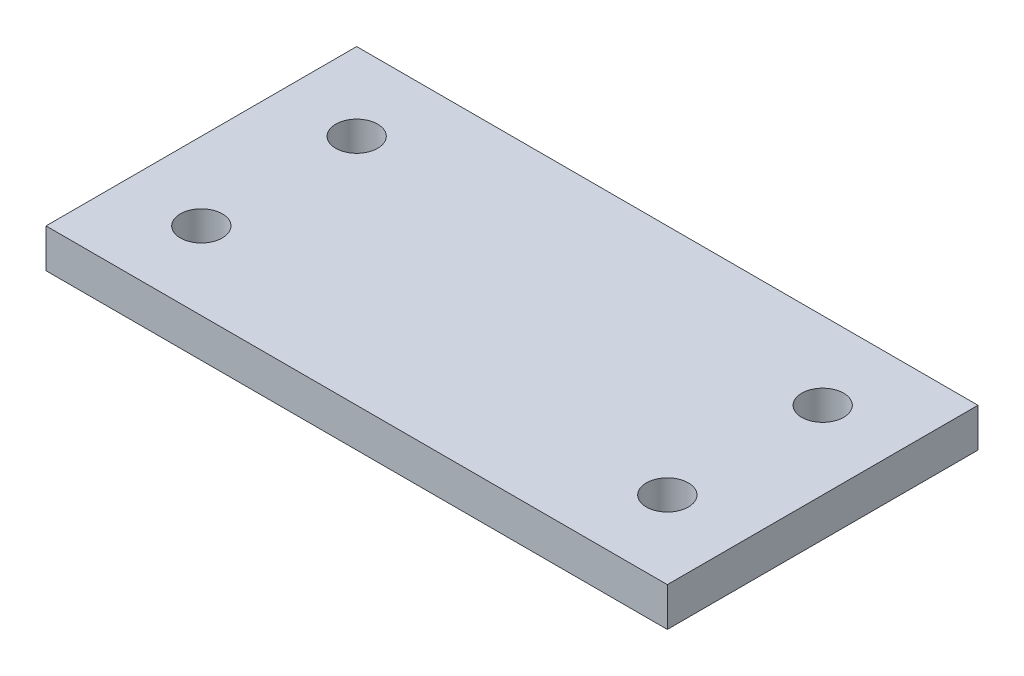
ISO-10303-21;
HEADER;
FILE_DESCRIPTION(('STEP AP214'),'2;1');
FILE_NAME('part.step','',(''),(''),'','','');
FILE_SCHEMA(('AUTOMOTIVE_DESIGN { 1 0 10303 214 1 1 1 1 }'));
ENDSEC;
DATA;
#1=APPLICATION_CONTEXT('core data for automotive mechanical design processes');
#2=APPLICATION_PROTOCOL_DEFINITION('international standard','automotive_design',2000,#1);
#3=PRODUCT_CONTEXT('',#1,'mechanical');
#4=PRODUCT('Part','Part','',(#3));
#5=PRODUCT_RELATED_PRODUCT_CATEGORY('part','',(#4));
#6=PRODUCT_DEFINITION_FORMATION('','',#4);
#7=PRODUCT_DEFINITION_CONTEXT('part definition',#1,'design');
#8=PRODUCT_DEFINITION('design','',#6,#7);
#9=PRODUCT_DEFINITION_SHAPE('','',#8);
#10=(LENGTH_UNIT() NAMED_UNIT(*) SI_UNIT(.MILLI.,.METRE.));
#11=(NAMED_UNIT(*) PLANE_ANGLE_UNIT() SI_UNIT($,.RADIAN.));
#12=(NAMED_UNIT(*) SI_UNIT($,.STERADIAN.) SOLID_ANGLE_UNIT());
#13=UNCERTAINTY_MEASURE_WITH_UNIT(LENGTH_MEASURE(1.E-05),#10,'distance_accuracy_value','');
#14=(GEOMETRIC_REPRESENTATION_CONTEXT(3) GLOBAL_UNCERTAINTY_ASSIGNED_CONTEXT((#13)) GLOBAL_UNIT_ASSIGNED_CONTEXT((#10,
#11,#12)) REPRESENTATION_CONTEXT('',''));
#15=CARTESIAN_POINT('',(0.,0.,0.));
#16=DIRECTION('',(0.,0.,1.));
#17=DIRECTION('',(1.,0.,0.));
#18=AXIS2_PLACEMENT_3D('',#15,#16,#17);
#19=CARTESIAN_POINT('',(50.8,6.35,-25.4));
#20=DIRECTION('',(-1.,0.,0.));
#21=DIRECTION('',(0.,0.,1.));
#22=AXIS2_PLACEMENT_3D('',#19,#20,#21);
#23=PLANE('',#22);
#24=DIRECTION('',(0.,0.,-1.));
#25=VECTOR('',#24,1.);
#26=CARTESIAN_POINT('',(50.8,0.,-25.4));
#27=LINE('',#26,#25);
#28=CARTESIAN_POINT('',(50.8,0.,25.4));
#29=VERTEX_POINT('',#28);
#30=CARTESIAN_POINT('',(50.8,0.,-25.4));
#31=VERTEX_POINT('',#30);
#32=EDGE_CURVE('E95',#29,#31,#27,.T.);
#33=ORIENTED_EDGE('',*,*,#32,.T.);
#34=DIRECTION('',(0.,-1.,0.));
#35=VECTOR('',#34,1.);
#36=CARTESIAN_POINT('',(50.8,6.35,-25.4));
#37=LINE('',#36,#35);
#38=CARTESIAN_POINT('',(50.8,6.35,-25.4));
#39=VERTEX_POINT('',#38);
#40=EDGE_CURVE('E11',#39,#31,#37,.T.);
#41=ORIENTED_EDGE('',*,*,#40,.F.);
#42=DIRECTION('',(0.,0.,-1.));
#43=VECTOR('',#42,1.);
#44=CARTESIAN_POINT('',(50.8,6.35,-25.4));
#45=LINE('',#44,#43);
#46=CARTESIAN_POINT('',(50.8,6.35,25.4));
#47=VERTEX_POINT('',#46);
#48=EDGE_CURVE('E83',#47,#39,#45,.T.);
#49=ORIENTED_EDGE('',*,*,#48,.F.);
#50=DIRECTION('',(0.,-1.,0.));
#51=VECTOR('',#50,1.);
#52=CARTESIAN_POINT('',(50.8,6.35,25.4));
#53=LINE('',#52,#51);
#54=EDGE_CURVE('E91',#47,#29,#53,.T.);
#55=ORIENTED_EDGE('',*,*,#54,.T.);
#56=EDGE_LOOP('',(#33,#41,#49,#55));
#57=FACE_BOUND('',#56,.T.);
#58=ADVANCED_FACE('F32',(#57),#23,.F.);
#59=CARTESIAN_POINT('',(-50.8,6.35,-25.4));
#60=DIRECTION('',(0.,0.,1.));
#61=DIRECTION('',(1.,0.,0.));
#62=AXIS2_PLACEMENT_3D('',#59,#60,#61);
#63=PLANE('',#62);
#64=DIRECTION('',(-1.,0.,0.));
#65=VECTOR('',#64,1.);
#66=CARTESIAN_POINT('',(-50.8,0.,-25.4));
#67=LINE('',#66,#65);
#68=CARTESIAN_POINT('',(-50.8,0.,-25.4));
#69=VERTEX_POINT('',#68);
#70=EDGE_CURVE('E87',#31,#69,#67,.T.);
#71=ORIENTED_EDGE('',*,*,#70,.T.);
#72=DIRECTION('',(0.,-1.,0.));
#73=VECTOR('',#72,1.);
#74=CARTESIAN_POINT('',(-50.8,6.35,-25.4));
#75=LINE('',#74,#73);
#76=CARTESIAN_POINT('',(-50.8,6.35,-25.4));
#77=VERTEX_POINT('',#76);
#78=EDGE_CURVE('E40',#77,#69,#75,.T.);
#79=ORIENTED_EDGE('',*,*,#78,.F.);
#80=DIRECTION('',(-1.,0.,0.));
#81=VECTOR('',#80,1.);
#82=CARTESIAN_POINT('',(-50.8,6.35,-25.4));
#83=LINE('',#82,#81);
#84=EDGE_CURVE('E78',#39,#77,#83,.T.);
#85=ORIENTED_EDGE('',*,*,#84,.F.);
#86=ORIENTED_EDGE('',*,*,#40,.T.);
#87=EDGE_LOOP('',(#71,#79,#85,#86));
#88=FACE_BOUND('',#87,.T.);
#89=ADVANCED_FACE('F86',(#88),#63,.F.);
#90=CARTESIAN_POINT('',(-50.8,6.35,-25.4));
#91=DIRECTION('',(1.,0.,0.));
#92=DIRECTION('',(0.,0.,-1.));
#93=AXIS2_PLACEMENT_3D('',#90,#91,#92);
#94=PLANE('',#93);
#95=DIRECTION('',(0.,0.,1.));
#96=VECTOR('',#95,1.);
#97=CARTESIAN_POINT('',(-50.8,0.,-25.4));
#98=LINE('',#97,#96);
#99=CARTESIAN_POINT('',(-50.8,0.,25.4));
#100=VERTEX_POINT('',#99);
#101=EDGE_CURVE('E65',#69,#100,#98,.T.);
#102=ORIENTED_EDGE('',*,*,#101,.T.);
#103=DIRECTION('',(0.,-1.,0.));
#104=VECTOR('',#103,1.);
#105=CARTESIAN_POINT('',(-50.8,6.35,25.4));
#106=LINE('',#105,#104);
#107=CARTESIAN_POINT('',(-50.8,6.35,25.4));
#108=VERTEX_POINT('',#107);
#109=EDGE_CURVE('E88',#108,#100,#106,.T.);
#110=ORIENTED_EDGE('',*,*,#109,.F.);
#111=DIRECTION('',(0.,0.,1.));
#112=VECTOR('',#111,1.);
#113=CARTESIAN_POINT('',(-50.8,6.35,-25.4));
#114=LINE('',#113,#112);
#115=EDGE_CURVE('E81',#77,#108,#114,.T.);
#116=ORIENTED_EDGE('',*,*,#115,.F.);
#117=ORIENTED_EDGE('',*,*,#78,.T.);
#118=EDGE_LOOP('',(#102,#110,#116,#117));
#119=FACE_BOUND('',#118,.T.);
#120=ADVANCED_FACE('F89',(#119),#94,.F.);
#121=CARTESIAN_POINT('',(-50.8,6.35,25.4));
#122=DIRECTION('',(0.,0.,-1.));
#123=DIRECTION('',(-1.,0.,0.));
#124=AXIS2_PLACEMENT_3D('',#121,#122,#123);
#125=PLANE('',#124);
#126=DIRECTION('',(1.,0.,0.));
#127=VECTOR('',#126,1.);
#128=CARTESIAN_POINT('',(-50.8,0.,25.4));
#129=LINE('',#128,#127);
#130=EDGE_CURVE('E71',#100,#29,#129,.T.);
#131=ORIENTED_EDGE('',*,*,#130,.T.);
#132=ORIENTED_EDGE('',*,*,#54,.F.);
#133=DIRECTION('',(1.,0.,0.));
#134=VECTOR('',#133,1.);
#135=CARTESIAN_POINT('',(-50.8,6.35,25.4));
#136=LINE('',#135,#134);
#137=EDGE_CURVE('E48',#108,#47,#136,.T.);
#138=ORIENTED_EDGE('',*,*,#137,.F.);
#139=ORIENTED_EDGE('',*,*,#109,.T.);
#140=EDGE_LOOP('',(#131,#132,#138,#139));
#141=FACE_BOUND('',#140,.T.);
#142=ADVANCED_FACE('F103',(#141),#125,.F.);
#143=CARTESIAN_POINT('',(0.,6.35,0.));
#144=DIRECTION('',(0.,1.,0.));
#145=DIRECTION('',(0.,0.,1.));
#146=AXIS2_PLACEMENT_3D('',#143,#144,#145);
#147=PLANE('',#146);
#148=CARTESIAN_POINT('',(38.1,6.35,-12.7));
#149=DIRECTION('',(0.,1.,0.));
#150=DIRECTION('',(0.,0.,1.));
#151=AXIS2_PLACEMENT_3D('',#148,#149,#150);
#152=CIRCLE('',#151,3.429);
#153=CARTESIAN_POINT('',(38.1,6.35,-9.27099999999999));
#154=VERTEX_POINT('',#153);
#155=EDGE_CURVE('E127',#154,#154,#152,.F.);
#156=ORIENTED_EDGE('',*,*,#155,.T.);
#157=EDGE_LOOP('',(#156));
#158=FACE_BOUND('',#157,.T.);
#159=CARTESIAN_POINT('',(38.1,6.35,12.7));
#160=DIRECTION('',(0.,1.,0.));
#161=DIRECTION('',(0.,0.,1.));
#162=AXIS2_PLACEMENT_3D('',#159,#160,#161);
#163=CIRCLE('',#162,3.42899999999999);
#164=CARTESIAN_POINT('',(38.1,6.35,16.129));
#165=VERTEX_POINT('',#164);
#166=EDGE_CURVE('E121',#165,#165,#163,.F.);
#167=ORIENTED_EDGE('',*,*,#166,.T.);
#168=EDGE_LOOP('',(#167));
#169=FACE_BOUND('',#168,.T.);
#170=CARTESIAN_POINT('',(-38.1,6.35,-12.7));
#171=DIRECTION('',(0.,1.,0.));
#172=DIRECTION('',(0.,0.,1.));
#173=AXIS2_PLACEMENT_3D('',#170,#171,#172);
#174=CIRCLE('',#173,3.429);
#175=CARTESIAN_POINT('',(-38.1,6.35,-9.271));
#176=VERTEX_POINT('',#175);
#177=EDGE_CURVE('E115',#176,#176,#174,.F.);
#178=ORIENTED_EDGE('',*,*,#177,.T.);
#179=EDGE_LOOP('',(#178));
#180=FACE_BOUND('',#179,.T.);
#181=CARTESIAN_POINT('',(-38.1,6.35,12.7));
#182=DIRECTION('',(0.,1.,0.));
#183=DIRECTION('',(0.,0.,1.));
#184=AXIS2_PLACEMENT_3D('',#181,#182,#183);
#185=CIRCLE('',#184,3.429);
#186=CARTESIAN_POINT('',(-38.1,6.35,16.129));
#187=VERTEX_POINT('',#186);
#188=EDGE_CURVE('E109',#187,#187,#185,.F.);
#189=ORIENTED_EDGE('',*,*,#188,.T.);
#190=EDGE_LOOP('',(#189));
#191=FACE_BOUND('',#190,.T.);
#192=ORIENTED_EDGE('',*,*,#48,.T.);
#193=ORIENTED_EDGE('',*,*,#84,.T.);
#194=ORIENTED_EDGE('',*,*,#115,.T.);
#195=ORIENTED_EDGE('',*,*,#137,.T.);
#196=EDGE_LOOP('',(#192,#193,#194,#195));
#197=FACE_BOUND('',#196,.T.);
#198=ADVANCED_FACE('F79',(#158,#169,#180,#191,#197),#147,.T.);
#199=CARTESIAN_POINT('',(0.,0.,0.));
#200=DIRECTION('',(0.,1.,0.));
#201=DIRECTION('',(0.,0.,1.));
#202=AXIS2_PLACEMENT_3D('',#199,#200,#201);
#203=PLANE('',#202);
#204=CARTESIAN_POINT('',(38.1,0.,-12.7));
#205=DIRECTION('',(0.,-1.,0.));
#206=DIRECTION('',(0.,0.,-1.));
#207=AXIS2_PLACEMENT_3D('',#204,#205,#206);
#208=CIRCLE('',#207,3.429);
#209=CARTESIAN_POINT('',(38.1,0.,-16.129));
#210=VERTEX_POINT('',#209);
#211=EDGE_CURVE('E124',#210,#210,#208,.T.);
#212=ORIENTED_EDGE('',*,*,#211,.F.);
#213=EDGE_LOOP('',(#212));
#214=FACE_BOUND('',#213,.T.);
#215=CARTESIAN_POINT('',(38.1,0.,12.7));
#216=DIRECTION('',(0.,-1.,0.));
#217=DIRECTION('',(0.,0.,1.));
#218=AXIS2_PLACEMENT_3D('',#215,#216,#217);
#219=CIRCLE('',#218,3.42899999999999);
#220=CARTESIAN_POINT('',(38.1,0.,16.129));
#221=VERTEX_POINT('',#220);
#222=EDGE_CURVE('E118',#221,#221,#219,.T.);
#223=ORIENTED_EDGE('',*,*,#222,.F.);
#224=EDGE_LOOP('',(#223));
#225=FACE_BOUND('',#224,.T.);
#226=CARTESIAN_POINT('',(-38.1,0.,-12.7));
#227=DIRECTION('',(0.,-1.,0.));
#228=DIRECTION('',(0.,0.,1.));
#229=AXIS2_PLACEMENT_3D('',#226,#227,#228);
#230=CIRCLE('',#229,3.429);
#231=CARTESIAN_POINT('',(-38.1,0.,-9.271));
#232=VERTEX_POINT('',#231);
#233=EDGE_CURVE('E112',#232,#232,#230,.T.);
#234=ORIENTED_EDGE('',*,*,#233,.F.);
#235=EDGE_LOOP('',(#234));
#236=FACE_BOUND('',#235,.T.);
#237=CARTESIAN_POINT('',(-38.1,0.,12.7));
#238=DIRECTION('',(0.,-1.,0.));
#239=DIRECTION('',(0.,0.,-1.));
#240=AXIS2_PLACEMENT_3D('',#237,#238,#239);
#241=CIRCLE('',#240,3.429);
#242=CARTESIAN_POINT('',(-38.1,0.,9.271));
#243=VERTEX_POINT('',#242);
#244=EDGE_CURVE('E98',#243,#243,#241,.T.);
#245=ORIENTED_EDGE('',*,*,#244,.F.);
#246=EDGE_LOOP('',(#245));
#247=FACE_BOUND('',#246,.T.);
#248=ORIENTED_EDGE('',*,*,#32,.F.);
#249=ORIENTED_EDGE('',*,*,#130,.F.);
#250=ORIENTED_EDGE('',*,*,#101,.F.);
#251=ORIENTED_EDGE('',*,*,#70,.F.);
#252=EDGE_LOOP('',(#248,#249,#250,#251));
#253=FACE_BOUND('',#252,.T.);
#254=ADVANCED_FACE('F106',(#214,#225,#236,#247,#253),#203,.F.);
#255=CARTESIAN_POINT('',(-38.1,6.351,12.7));
#256=DIRECTION('',(0.,-1.,0.));
#257=DIRECTION('',(0.,0.,-1.));
#258=AXIS2_PLACEMENT_3D('',#255,#256,#257);
#259=CYLINDRICAL_SURFACE('',#258,3.429);
#260=ORIENTED_EDGE('',*,*,#188,.F.);
#261=EDGE_LOOP('',(#260));
#262=FACE_BOUND('',#261,.T.);
#263=ORIENTED_EDGE('',*,*,#244,.T.);
#264=EDGE_LOOP('',(#263));
#265=FACE_BOUND('',#264,.T.);
#266=ADVANCED_FACE('F137',(#262,#265),#259,.F.);
#267=CARTESIAN_POINT('',(-38.1,6.351,-12.7));
#268=DIRECTION('',(0.,-1.,0.));
#269=DIRECTION('',(0.,0.,-1.));
#270=AXIS2_PLACEMENT_3D('',#267,#268,#269);
#271=CYLINDRICAL_SURFACE('',#270,3.429);
#272=ORIENTED_EDGE('',*,*,#177,.F.);
#273=EDGE_LOOP('',(#272));
#274=FACE_BOUND('',#273,.T.);
#275=ORIENTED_EDGE('',*,*,#233,.T.);
#276=EDGE_LOOP('',(#275));
#277=FACE_BOUND('',#276,.T.);
#278=ADVANCED_FACE('F146',(#274,#277),#271,.F.);
#279=CARTESIAN_POINT('',(38.1,6.351,12.7));
#280=DIRECTION('',(0.,-1.,0.));
#281=DIRECTION('',(0.,0.,-1.));
#282=AXIS2_PLACEMENT_3D('',#279,#280,#281);
#283=CYLINDRICAL_SURFACE('',#282,3.42899999999999);
#284=ORIENTED_EDGE('',*,*,#166,.F.);
#285=EDGE_LOOP('',(#284));
#286=FACE_BOUND('',#285,.T.);
#287=ORIENTED_EDGE('',*,*,#222,.T.);
#288=EDGE_LOOP('',(#287));
#289=FACE_BOUND('',#288,.T.);
#290=ADVANCED_FACE('F152',(#286,#289),#283,.F.);
#291=CARTESIAN_POINT('',(38.1,6.351,-12.7));
#292=DIRECTION('',(0.,-1.,0.));
#293=DIRECTION('',(0.,0.,-1.));
#294=AXIS2_PLACEMENT_3D('',#291,#292,#293);
#295=CYLINDRICAL_SURFACE('',#294,3.429);
#296=ORIENTED_EDGE('',*,*,#155,.F.);
#297=EDGE_LOOP('',(#296));
#298=FACE_BOUND('',#297,.T.);
#299=ORIENTED_EDGE('',*,*,#211,.T.);
#300=EDGE_LOOP('',(#299));
#301=FACE_BOUND('',#300,.T.);
#302=ADVANCED_FACE('F133',(#298,#301),#295,.F.);
#303=CLOSED_SHELL('',(#58,#89,#120,#142,#198,#254,#266,#278,#290,#302));
#304=MANIFOLD_SOLID_BREP('B2',#303);
#305=ADVANCED_BREP_SHAPE_REPRESENTATION('',(#18,#304),#14);
#306=SHAPE_DEFINITION_REPRESENTATION(#9,#305);
ENDSEC;
END-ISO-10303-21;
